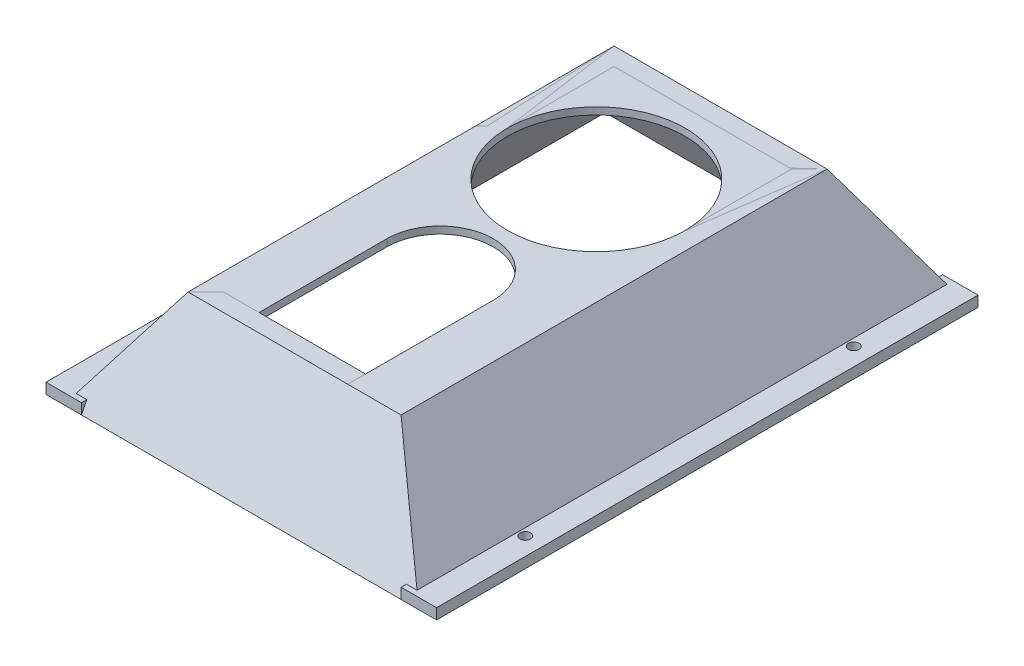
ISO-10303-21;
HEADER;
FILE_DESCRIPTION(('STEP AP214'),'2;1');
FILE_NAME('part.step','',(''),(''),'','','');
FILE_SCHEMA(('AUTOMOTIVE_DESIGN { 1 0 10303 214 1 1 1 1 }'));
ENDSEC;
DATA;
#1=APPLICATION_CONTEXT('core data for automotive mechanical design processes');
#2=APPLICATION_PROTOCOL_DEFINITION('international standard','automotive_design',2000,#1);
#3=PRODUCT_CONTEXT('',#1,'mechanical');
#4=PRODUCT('Part','Part','',(#3));
#5=PRODUCT_RELATED_PRODUCT_CATEGORY('part','',(#4));
#6=PRODUCT_DEFINITION_FORMATION('','',#4);
#7=PRODUCT_DEFINITION_CONTEXT('part definition',#1,'design');
#8=PRODUCT_DEFINITION('design','',#6,#7);
#9=PRODUCT_DEFINITION_SHAPE('','',#8);
#10=(LENGTH_UNIT() NAMED_UNIT(*) SI_UNIT(.MILLI.,.METRE.));
#11=(NAMED_UNIT(*) PLANE_ANGLE_UNIT() SI_UNIT($,.RADIAN.));
#12=(NAMED_UNIT(*) SI_UNIT($,.STERADIAN.) SOLID_ANGLE_UNIT());
#13=UNCERTAINTY_MEASURE_WITH_UNIT(LENGTH_MEASURE(1.E-05),#10,'distance_accuracy_value','');
#14=(GEOMETRIC_REPRESENTATION_CONTEXT(3) GLOBAL_UNCERTAINTY_ASSIGNED_CONTEXT((#13)) GLOBAL_UNIT_ASSIGNED_CONTEXT((#10,
#11,#12)) REPRESENTATION_CONTEXT('',''));
#15=CARTESIAN_POINT('',(0.,0.,0.));
#16=DIRECTION('',(0.,0.,1.));
#17=DIRECTION('',(1.,0.,0.));
#18=AXIS2_PLACEMENT_3D('',#15,#16,#17);
#19=CARTESIAN_POINT('',(0.,28.,-56.));
#20=DIRECTION('',(0.,1.,0.));
#21=DIRECTION('',(0.,0.,1.));
#22=AXIS2_PLACEMENT_3D('',#19,#20,#21);
#23=CYLINDRICAL_SURFACE('',#22,15.);
#24=CARTESIAN_POINT('',(0.,30.,-56.));
#25=DIRECTION('',(0.,1.,0.));
#26=DIRECTION('',(0.,0.,1.));
#27=AXIS2_PLACEMENT_3D('',#24,#25,#26);
#28=CIRCLE('',#27,15.);
#29=CARTESIAN_POINT('',(-15.,30.,-56.));
#30=VERTEX_POINT('',#29);
#31=CARTESIAN_POINT('',(15.,30.,-56.));
#32=VERTEX_POINT('',#31);
#33=EDGE_CURVE('E173',#30,#32,#28,.F.);
#34=ORIENTED_EDGE('',*,*,#33,.F.);
#35=DIRECTION('',(0.,1.,0.));
#36=VECTOR('',#35,1.);
#37=CARTESIAN_POINT('',(-15.,28.,-56.));
#38=LINE('',#37,#36);
#39=CARTESIAN_POINT('',(-15.,28.,-56.));
#40=VERTEX_POINT('',#39);
#41=EDGE_CURVE('E13',#40,#30,#38,.T.);
#42=ORIENTED_EDGE('',*,*,#41,.F.);
#43=CARTESIAN_POINT('',(0.,28.,-56.));
#44=DIRECTION('',(0.,1.,0.));
#45=DIRECTION('',(0.,0.,1.));
#46=AXIS2_PLACEMENT_3D('',#43,#44,#45);
#47=CIRCLE('',#46,15.);
#48=CARTESIAN_POINT('',(15.,28.,-56.));
#49=VERTEX_POINT('',#48);
#50=EDGE_CURVE('E202',#40,#49,#47,.F.);
#51=ORIENTED_EDGE('',*,*,#50,.T.);
#52=DIRECTION('',(0.,1.,0.));
#53=VECTOR('',#52,1.);
#54=CARTESIAN_POINT('',(15.,28.,-56.));
#55=LINE('',#54,#53);
#56=EDGE_CURVE('E75',#49,#32,#55,.T.);
#57=ORIENTED_EDGE('',*,*,#56,.T.);
#58=EDGE_LOOP('',(#34,#42,#51,#57));
#59=FACE_BOUND('',#58,.T.);
#60=ADVANCED_FACE('F71',(#59),#23,.F.);
#61=CARTESIAN_POINT('',(-15.,28.,0.));
#62=DIRECTION('',(-1.,0.,0.));
#63=DIRECTION('',(0.,0.,1.));
#64=AXIS2_PLACEMENT_3D('',#61,#62,#63);
#65=PLANE('',#64);
#66=DIRECTION('',(0.,0.,1.));
#67=VECTOR('',#66,1.);
#68=CARTESIAN_POINT('',(-15.,30.,0.));
#69=LINE('',#68,#67);
#70=CARTESIAN_POINT('',(-15.,30.,-15.));
#71=VERTEX_POINT('',#70);
#72=EDGE_CURVE('E191',#30,#71,#69,.T.);
#73=ORIENTED_EDGE('',*,*,#72,.T.);
#74=DIRECTION('',(0.,1.,0.));
#75=VECTOR('',#74,1.);
#76=CARTESIAN_POINT('',(-15.,28.,-15.));
#77=LINE('',#76,#75);
#78=CARTESIAN_POINT('',(-15.,28.,-15.));
#79=VERTEX_POINT('',#78);
#80=EDGE_CURVE('E81',#79,#71,#77,.T.);
#81=ORIENTED_EDGE('',*,*,#80,.F.);
#82=DIRECTION('',(0.,0.,1.));
#83=VECTOR('',#82,1.);
#84=CARTESIAN_POINT('',(-15.,28.,0.));
#85=LINE('',#84,#83);
#86=EDGE_CURVE('E159',#40,#79,#85,.T.);
#87=ORIENTED_EDGE('',*,*,#86,.F.);
#88=ORIENTED_EDGE('',*,*,#41,.T.);
#89=EDGE_LOOP('',(#73,#81,#87,#88));
#90=FACE_BOUND('',#89,.T.);
#91=ADVANCED_FACE('F206',(#90),#65,.F.);
#92=CARTESIAN_POINT('',(0.,28.,-15.));
#93=DIRECTION('',(0.,0.,1.));
#94=DIRECTION('',(1.,0.,0.));
#95=AXIS2_PLACEMENT_3D('',#92,#93,#94);
#96=PLANE('',#95);
#97=DIRECTION('',(1.,0.,0.));
#98=VECTOR('',#97,1.);
#99=CARTESIAN_POINT('',(0.,30.,-15.));
#100=LINE('',#99,#98);
#101=CARTESIAN_POINT('',(-30.,30.,-15.));
#102=VERTEX_POINT('',#101);
#103=EDGE_CURVE('E146',#102,#71,#100,.T.);
#104=ORIENTED_EDGE('',*,*,#103,.F.);
#105=DIRECTION('',(0.,1.,0.));
#106=VECTOR('',#105,1.);
#107=CARTESIAN_POINT('',(-30.,28.,-15.));
#108=LINE('',#107,#106);
#109=CARTESIAN_POINT('',(-30.,28.,-15.));
#110=VERTEX_POINT('',#109);
#111=EDGE_CURVE('E141',#110,#102,#108,.T.);
#112=ORIENTED_EDGE('',*,*,#111,.F.);
#113=DIRECTION('',(1.,0.,0.));
#114=VECTOR('',#113,1.);
#115=CARTESIAN_POINT('',(0.,28.,-15.));
#116=LINE('',#115,#114);
#117=EDGE_CURVE('E144',#110,#79,#116,.T.);
#118=ORIENTED_EDGE('',*,*,#117,.T.);
#119=ORIENTED_EDGE('',*,*,#80,.T.);
#120=EDGE_LOOP('',(#104,#112,#118,#119));
#121=FACE_BOUND('',#120,.T.);
#122=ADVANCED_FACE('F143',(#121),#96,.T.);
#123=CARTESIAN_POINT('',(-30.,28.,0.));
#124=DIRECTION('',(-1.,0.,0.));
#125=DIRECTION('',(0.,0.,1.));
#126=AXIS2_PLACEMENT_3D('',#123,#124,#125);
#127=PLANE('',#126);
#128=DIRECTION('',(0.,0.,1.));
#129=VECTOR('',#128,1.);
#130=CARTESIAN_POINT('',(-30.,30.,0.));
#131=LINE('',#130,#129);
#132=CARTESIAN_POINT('',(-30.,30.,-135.));
#133=VERTEX_POINT('',#132);
#134=EDGE_CURVE('E188',#133,#102,#131,.T.);
#135=ORIENTED_EDGE('',*,*,#134,.F.);
#136=DIRECTION('',(0.,1.,0.));
#137=VECTOR('',#136,1.);
#138=CARTESIAN_POINT('',(-30.,28.,-135.));
#139=LINE('',#138,#137);
#140=CARTESIAN_POINT('',(-30.,28.,-135.));
#141=VERTEX_POINT('',#140);
#142=EDGE_CURVE('E151',#141,#133,#139,.T.);
#143=ORIENTED_EDGE('',*,*,#142,.F.);
#144=DIRECTION('',(0.,0.,1.));
#145=VECTOR('',#144,1.);
#146=CARTESIAN_POINT('',(-30.,28.,0.));
#147=LINE('',#146,#145);
#148=EDGE_CURVE('E158',#141,#110,#147,.T.);
#149=ORIENTED_EDGE('',*,*,#148,.T.);
#150=ORIENTED_EDGE('',*,*,#111,.T.);
#151=EDGE_LOOP('',(#135,#143,#149,#150));
#152=FACE_BOUND('',#151,.T.);
#153=ADVANCED_FACE('F161',(#152),#127,.T.);
#154=CARTESIAN_POINT('',(0.,28.,-135.));
#155=DIRECTION('',(0.,0.,1.));
#156=DIRECTION('',(1.,0.,0.));
#157=AXIS2_PLACEMENT_3D('',#154,#155,#156);
#158=PLANE('',#157);
#159=DIRECTION('',(1.,0.,0.));
#160=VECTOR('',#159,1.);
#161=CARTESIAN_POINT('',(0.,30.,-135.));
#162=LINE('',#161,#160);
#163=CARTESIAN_POINT('',(30.,30.,-135.));
#164=VERTEX_POINT('',#163);
#165=EDGE_CURVE('E185',#133,#164,#162,.T.);
#166=ORIENTED_EDGE('',*,*,#165,.T.);
#167=DIRECTION('',(0.,1.,0.));
#168=VECTOR('',#167,1.);
#169=CARTESIAN_POINT('',(30.,28.,-135.));
#170=LINE('',#169,#168);
#171=CARTESIAN_POINT('',(30.,28.,-135.));
#172=VERTEX_POINT('',#171);
#173=EDGE_CURVE('E196',#172,#164,#170,.T.);
#174=ORIENTED_EDGE('',*,*,#173,.F.);
#175=DIRECTION('',(1.,0.,0.));
#176=VECTOR('',#175,1.);
#177=CARTESIAN_POINT('',(0.,28.,-135.));
#178=LINE('',#177,#176);
#179=EDGE_CURVE('E163',#141,#172,#178,.T.);
#180=ORIENTED_EDGE('',*,*,#179,.F.);
#181=ORIENTED_EDGE('',*,*,#142,.T.);
#182=EDGE_LOOP('',(#166,#174,#180,#181));
#183=FACE_BOUND('',#182,.T.);
#184=ADVANCED_FACE('F224',(#183),#158,.F.);
#185=CARTESIAN_POINT('',(30.,28.,0.));
#186=DIRECTION('',(-1.,0.,0.));
#187=DIRECTION('',(0.,0.,1.));
#188=AXIS2_PLACEMENT_3D('',#185,#186,#187);
#189=PLANE('',#188);
#190=DIRECTION('',(0.,0.,1.));
#191=VECTOR('',#190,1.);
#192=CARTESIAN_POINT('',(30.,30.,0.));
#193=LINE('',#192,#191);
#194=CARTESIAN_POINT('',(30.,30.,-15.));
#195=VERTEX_POINT('',#194);
#196=EDGE_CURVE('E182',#164,#195,#193,.T.);
#197=ORIENTED_EDGE('',*,*,#196,.T.);
#198=DIRECTION('',(0.,1.,0.));
#199=VECTOR('',#198,1.);
#200=CARTESIAN_POINT('',(30.,28.,-15.));
#201=LINE('',#200,#199);
#202=CARTESIAN_POINT('',(30.,28.,-15.));
#203=VERTEX_POINT('',#202);
#204=EDGE_CURVE('E199',#203,#195,#201,.T.);
#205=ORIENTED_EDGE('',*,*,#204,.F.);
#206=DIRECTION('',(0.,0.,1.));
#207=VECTOR('',#206,1.);
#208=CARTESIAN_POINT('',(30.,28.,0.));
#209=LINE('',#208,#207);
#210=EDGE_CURVE('E165',#172,#203,#209,.T.);
#211=ORIENTED_EDGE('',*,*,#210,.F.);
#212=ORIENTED_EDGE('',*,*,#173,.T.);
#213=EDGE_LOOP('',(#197,#205,#211,#212));
#214=FACE_BOUND('',#213,.T.);
#215=ADVANCED_FACE('F219',(#214),#189,.F.);
#216=CARTESIAN_POINT('',(0.,28.,-15.));
#217=DIRECTION('',(0.,0.,1.));
#218=DIRECTION('',(1.,0.,0.));
#219=AXIS2_PLACEMENT_3D('',#216,#217,#218);
#220=PLANE('',#219);
#221=DIRECTION('',(1.,0.,0.));
#222=VECTOR('',#221,1.);
#223=CARTESIAN_POINT('',(0.,30.,-15.));
#224=LINE('',#223,#222);
#225=CARTESIAN_POINT('',(15.,30.,-15.));
#226=VERTEX_POINT('',#225);
#227=EDGE_CURVE('E179',#226,#195,#224,.T.);
#228=ORIENTED_EDGE('',*,*,#227,.F.);
#229=DIRECTION('',(0.,1.,0.));
#230=VECTOR('',#229,1.);
#231=CARTESIAN_POINT('',(15.,28.,-15.));
#232=LINE('',#231,#230);
#233=CARTESIAN_POINT('',(15.,28.,-15.));
#234=VERTEX_POINT('',#233);
#235=EDGE_CURVE('E200',#234,#226,#232,.T.);
#236=ORIENTED_EDGE('',*,*,#235,.F.);
#237=DIRECTION('',(1.,0.,0.));
#238=VECTOR('',#237,1.);
#239=CARTESIAN_POINT('',(0.,28.,-15.));
#240=LINE('',#239,#238);
#241=EDGE_CURVE('E210',#234,#203,#240,.T.);
#242=ORIENTED_EDGE('',*,*,#241,.T.);
#243=ORIENTED_EDGE('',*,*,#204,.T.);
#244=EDGE_LOOP('',(#228,#236,#242,#243));
#245=FACE_BOUND('',#244,.T.);
#246=ADVANCED_FACE('F221',(#245),#220,.T.);
#247=CARTESIAN_POINT('',(0.,28.,-100.));
#248=DIRECTION('',(0.,1.,0.));
#249=DIRECTION('',(0.,0.,1.));
#250=AXIS2_PLACEMENT_3D('',#247,#248,#249);
#251=CYLINDRICAL_SURFACE('',#250,25.);
#252=CARTESIAN_POINT('',(0.,28.,-100.));
#253=DIRECTION('',(0.,1.,0.));
#254=DIRECTION('',(0.,0.,1.));
#255=AXIS2_PLACEMENT_3D('',#252,#253,#254);
#256=CIRCLE('',#255,25.);
#257=CARTESIAN_POINT('',(0.,28.,-75.));
#258=VERTEX_POINT('',#257);
#259=EDGE_CURVE('E192',#258,#258,#256,.T.);
#260=ORIENTED_EDGE('',*,*,#259,.F.);
#261=EDGE_LOOP('',(#260));
#262=FACE_BOUND('',#261,.T.);
#263=CARTESIAN_POINT('',(0.,30.,-100.));
#264=DIRECTION('',(0.,1.,0.));
#265=DIRECTION('',(0.,0.,1.));
#266=AXIS2_PLACEMENT_3D('',#263,#264,#265);
#267=CIRCLE('',#266,25.);
#268=CARTESIAN_POINT('',(0.,30.,-75.));
#269=VERTEX_POINT('',#268);
#270=EDGE_CURVE('E170',#269,#269,#267,.T.);
#271=ORIENTED_EDGE('',*,*,#270,.T.);
#272=EDGE_LOOP('',(#271));
#273=FACE_BOUND('',#272,.T.);
#274=ADVANCED_FACE('F73',(#262,#273),#251,.F.);
#275=CARTESIAN_POINT('',(15.,28.,0.));
#276=DIRECTION('',(-1.,0.,0.));
#277=DIRECTION('',(0.,0.,1.));
#278=AXIS2_PLACEMENT_3D('',#275,#276,#277);
#279=PLANE('',#278);
#280=DIRECTION('',(0.,0.,1.));
#281=VECTOR('',#280,1.);
#282=CARTESIAN_POINT('',(15.,30.,0.));
#283=LINE('',#282,#281);
#284=EDGE_CURVE('E176',#32,#226,#283,.T.);
#285=ORIENTED_EDGE('',*,*,#284,.F.);
#286=ORIENTED_EDGE('',*,*,#56,.F.);
#287=DIRECTION('',(0.,0.,1.));
#288=VECTOR('',#287,1.);
#289=CARTESIAN_POINT('',(15.,28.,0.));
#290=LINE('',#289,#288);
#291=EDGE_CURVE('E208',#49,#234,#290,.T.);
#292=ORIENTED_EDGE('',*,*,#291,.T.);
#293=ORIENTED_EDGE('',*,*,#235,.T.);
#294=EDGE_LOOP('',(#285,#286,#292,#293));
#295=FACE_BOUND('',#294,.T.);
#296=ADVANCED_FACE('F203',(#295),#279,.T.);
#297=CARTESIAN_POINT('',(0.,28.,0.));
#298=DIRECTION('',(0.,1.,0.));
#299=DIRECTION('',(0.,0.,1.));
#300=AXIS2_PLACEMENT_3D('',#297,#298,#299);
#301=PLANE('',#300);
#302=ORIENTED_EDGE('',*,*,#259,.T.);
#303=EDGE_LOOP('',(#302));
#304=FACE_BOUND('',#303,.T.);
#305=ORIENTED_EDGE('',*,*,#50,.F.);
#306=ORIENTED_EDGE('',*,*,#86,.T.);
#307=ORIENTED_EDGE('',*,*,#117,.F.);
#308=ORIENTED_EDGE('',*,*,#148,.F.);
#309=ORIENTED_EDGE('',*,*,#179,.T.);
#310=ORIENTED_EDGE('',*,*,#210,.T.);
#311=ORIENTED_EDGE('',*,*,#241,.F.);
#312=ORIENTED_EDGE('',*,*,#291,.F.);
#313=EDGE_LOOP('',(#305,#306,#307,#308,#309,#310,#311,#312));
#314=FACE_BOUND('',#313,.T.);
#315=ADVANCED_FACE('F156',(#304,#314),#301,.F.);
#316=CARTESIAN_POINT('',(0.,30.,0.));
#317=DIRECTION('',(0.,1.,0.));
#318=DIRECTION('',(0.,0.,1.));
#319=AXIS2_PLACEMENT_3D('',#316,#317,#318);
#320=PLANE('',#319);
#321=ORIENTED_EDGE('',*,*,#270,.F.);
#322=EDGE_LOOP('',(#321));
#323=FACE_BOUND('',#322,.T.);
#324=ORIENTED_EDGE('',*,*,#33,.T.);
#325=ORIENTED_EDGE('',*,*,#284,.T.);
#326=ORIENTED_EDGE('',*,*,#227,.T.);
#327=ORIENTED_EDGE('',*,*,#196,.F.);
#328=ORIENTED_EDGE('',*,*,#165,.F.);
#329=ORIENTED_EDGE('',*,*,#134,.T.);
#330=ORIENTED_EDGE('',*,*,#103,.T.);
#331=ORIENTED_EDGE('',*,*,#72,.F.);
#332=EDGE_LOOP('',(#324,#325,#326,#327,#328,#329,#330,#331));
#333=FACE_BOUND('',#332,.T.);
#334=ADVANCED_FACE('F205',(#323,#333),#320,.T.);
#335=CLOSED_SHELL('',(#60,#91,#122,#153,#184,#215,#246,#274,#296,#315,#334));
#336=MANIFOLD_SOLID_BREP('B2',#335);
#337=CARTESIAN_POINT('',(0.,66.3730569948186,-113.782383419689));
#338=DIRECTION('',(0.,-0.503871025524086,0.863778900898434));
#339=DIRECTION('',(0.,-0.863778900898434,-0.503871025524086));
#340=AXIS2_PLACEMENT_3D('',#337,#338,#339);
#341=PLANE('',#340);
#342=DIRECTION('',(-1.,0.,0.));
#343=VECTOR('',#342,1.);
#344=CARTESIAN_POINT('',(0.,3.,-150.75));
#345=LINE('',#344,#343);
#346=CARTESIAN_POINT('',(48.,3.,-150.75));
#347=VERTEX_POINT('',#346);
#348=CARTESIAN_POINT('',(45.,3.,-150.75));
#349=VERTEX_POINT('',#348);
#350=EDGE_CURVE('E379',#347,#349,#345,.T.);
#351=ORIENTED_EDGE('',*,*,#350,.T.);
#352=DIRECTION('',(0.,-0.863778900898434,-0.503871025524086));
#353=VECTOR('',#352,1.);
#354=CARTESIAN_POINT('',(45.,66.3730569948186,-113.782383419689));
#355=LINE('',#354,#353);
#356=CARTESIAN_POINT('',(45.,0.,-152.5));
#357=VERTEX_POINT('',#356);
#358=EDGE_CURVE('E540',#349,#357,#355,.T.);
#359=ORIENTED_EDGE('',*,*,#358,.T.);
#360=DIRECTION('',(-1.,0.,0.));
#361=VECTOR('',#360,1.);
#362=CARTESIAN_POINT('',(-50.,0.,-152.5));
#363=LINE('',#362,#361);
#364=CARTESIAN_POINT('',(-45.,0.,-152.5));
#365=VERTEX_POINT('',#364);
#366=EDGE_CURVE('E563',#357,#365,#363,.T.);
#367=ORIENTED_EDGE('',*,*,#366,.T.);
#368=DIRECTION('',(0.,-0.863778900898434,-0.503871025524086));
#369=VECTOR('',#368,1.);
#370=CARTESIAN_POINT('',(-45.,66.3730569948186,-113.782383419689));
#371=LINE('',#370,#369);
#372=CARTESIAN_POINT('',(-45.,3.,-150.75));
#373=VERTEX_POINT('',#372);
#374=EDGE_CURVE('E945',#373,#365,#371,.T.);
#375=ORIENTED_EDGE('',*,*,#374,.F.);
#376=DIRECTION('',(-1.,0.,0.));
#377=VECTOR('',#376,1.);
#378=CARTESIAN_POINT('',(0.,3.,-150.75));
#379=LINE('',#378,#377);
#380=CARTESIAN_POINT('',(-48.,3.00000000000001,-150.75));
#381=VERTEX_POINT('',#380);
#382=EDGE_CURVE('E708',#373,#381,#379,.T.);
#383=ORIENTED_EDGE('',*,*,#382,.T.);
#384=DIRECTION('',(0.499026289241445,0.748539433862166,0.436648003086263));
#385=VECTOR('',#384,1.);
#386=CARTESIAN_POINT('',(-50.,0.,-152.5));
#387=LINE('',#386,#385);
#388=CARTESIAN_POINT('',(-30.,30.,-135.));
#389=VERTEX_POINT('',#388);
#390=EDGE_CURVE('E562',#381,#389,#387,.T.);
#391=ORIENTED_EDGE('',*,*,#390,.T.);
#392=DIRECTION('',(-1.,0.,0.));
#393=VECTOR('',#392,1.);
#394=CARTESIAN_POINT('',(-30.,30.,-135.));
#395=LINE('',#394,#393);
#396=CARTESIAN_POINT('',(30.,30.,-135.));
#397=VERTEX_POINT('',#396);
#398=EDGE_CURVE('E771',#397,#389,#395,.T.);
#399=ORIENTED_EDGE('',*,*,#398,.F.);
#400=DIRECTION('',(-0.499026289241443,0.748539433862167,0.436648003086264));
#401=VECTOR('',#400,1.);
#402=CARTESIAN_POINT('',(50.,0.,-152.5));
#403=LINE('',#402,#401);
#404=EDGE_CURVE('E725',#347,#397,#403,.T.);
#405=ORIENTED_EDGE('',*,*,#404,.F.);
#406=EDGE_LOOP('',(#351,#359,#367,#375,#383,#391,#399,#405));
#407=FACE_BOUND('',#406,.T.);
#408=ADVANCED_FACE('F360',(#407),#341,.F.);
#409=CARTESIAN_POINT('',(0.,0.,0.));
#410=DIRECTION('',(0.,-0.447213595499958,-0.894427190999916));
#411=DIRECTION('',(0.,0.894427190999916,-0.447213595499958));
#412=AXIS2_PLACEMENT_3D('',#409,#410,#411);
#413=PLANE('',#412);
#414=DIRECTION('',(1.,0.,0.));
#415=VECTOR('',#414,1.);
#416=CARTESIAN_POINT('',(-50.,0.,0.));
#417=LINE('',#416,#415);
#418=CARTESIAN_POINT('',(-45.,0.,0.));
#419=VERTEX_POINT('',#418);
#420=CARTESIAN_POINT('',(45.,0.,0.));
#421=VERTEX_POINT('',#420);
#422=EDGE_CURVE('E919',#419,#421,#417,.T.);
#423=ORIENTED_EDGE('',*,*,#422,.T.);
#424=DIRECTION('',(0.,0.894427190999916,-0.447213595499958));
#425=VECTOR('',#424,1.);
#426=CARTESIAN_POINT('',(45.,0.,0.));
#427=LINE('',#426,#425);
#428=CARTESIAN_POINT('',(45.,3.,-1.50000000000004));
#429=VERTEX_POINT('',#428);
#430=EDGE_CURVE('E387',#421,#429,#427,.T.);
#431=ORIENTED_EDGE('',*,*,#430,.T.);
#432=DIRECTION('',(1.,0.,0.));
#433=VECTOR('',#432,1.);
#434=CARTESIAN_POINT('',(0.,3.,-1.50000000000002));
#435=LINE('',#434,#433);
#436=CARTESIAN_POINT('',(48.,3.00000000000001,-1.50000000000003));
#437=VERTEX_POINT('',#436);
#438=EDGE_CURVE('E507',#429,#437,#435,.T.);
#439=ORIENTED_EDGE('',*,*,#438,.T.);
#440=DIRECTION('',(-0.512147519731584,0.768221279597376,-0.384110639798687));
#441=VECTOR('',#440,1.);
#442=CARTESIAN_POINT('',(50.,0.,0.));
#443=LINE('',#442,#441);
#444=CARTESIAN_POINT('',(30.,30.,-15.));
#445=VERTEX_POINT('',#444);
#446=EDGE_CURVE('E724',#437,#445,#443,.T.);
#447=ORIENTED_EDGE('',*,*,#446,.T.);
#448=DIRECTION('',(1.,0.,0.));
#449=VECTOR('',#448,1.);
#450=CARTESIAN_POINT('',(-30.,30.,-15.));
#451=LINE('',#450,#449);
#452=CARTESIAN_POINT('',(-30.,30.,-15.));
#453=VERTEX_POINT('',#452);
#454=EDGE_CURVE('E772',#453,#445,#451,.T.);
#455=ORIENTED_EDGE('',*,*,#454,.F.);
#456=DIRECTION('',(0.512147519731584,0.768221279597376,-0.384110639798688));
#457=VECTOR('',#456,1.);
#458=CARTESIAN_POINT('',(-50.,0.,0.));
#459=LINE('',#458,#457);
#460=CARTESIAN_POINT('',(-48.,3.,-1.5));
#461=VERTEX_POINT('',#460);
#462=EDGE_CURVE('E720',#461,#453,#459,.T.);
#463=ORIENTED_EDGE('',*,*,#462,.F.);
#464=DIRECTION('',(1.,0.,0.));
#465=VECTOR('',#464,1.);
#466=CARTESIAN_POINT('',(0.,3.,-1.50000000000002));
#467=LINE('',#466,#465);
#468=CARTESIAN_POINT('',(-45.,3.,-1.5));
#469=VERTEX_POINT('',#468);
#470=EDGE_CURVE('E371',#461,#469,#467,.T.);
#471=ORIENTED_EDGE('',*,*,#470,.T.);
#472=DIRECTION('',(0.,0.894427190999916,-0.447213595499958));
#473=VECTOR('',#472,1.);
#474=CARTESIAN_POINT('',(-45.,0.,0.));
#475=LINE('',#474,#473);
#476=EDGE_CURVE('E941',#419,#469,#475,.T.);
#477=ORIENTED_EDGE('',*,*,#476,.F.);
#478=EDGE_LOOP('',(#423,#431,#439,#447,#455,#463,#471,#477));
#479=FACE_BOUND('',#478,.T.);
#480=ADVANCED_FACE('F737',(#479),#413,.F.);
#481=CARTESIAN_POINT('',(0.,30.,0.));
#482=DIRECTION('',(0.,1.,0.));
#483=DIRECTION('',(0.,0.,1.));
#484=AXIS2_PLACEMENT_3D('',#481,#482,#483);
#485=PLANE('',#484);
#486=DIRECTION('',(0.,0.,-1.));
#487=VECTOR('',#486,1.);
#488=CARTESIAN_POINT('',(25.,30.,-130.));
#489=LINE('',#488,#487);
#490=CARTESIAN_POINT('',(25.,30.,-20.));
#491=VERTEX_POINT('',#490);
#492=CARTESIAN_POINT('',(25.,30.,-130.));
#493=VERTEX_POINT('',#492);
#494=EDGE_CURVE('E674',#491,#493,#489,.T.);
#495=ORIENTED_EDGE('',*,*,#494,.F.);
#496=DIRECTION('',(1.,0.,0.));
#497=VECTOR('',#496,1.);
#498=CARTESIAN_POINT('',(-25.,30.,-20.));
#499=LINE('',#498,#497);
#500=CARTESIAN_POINT('',(-25.,30.,-20.));
#501=VERTEX_POINT('',#500);
#502=EDGE_CURVE('E652',#501,#491,#499,.T.);
#503=ORIENTED_EDGE('',*,*,#502,.F.);
#504=DIRECTION('',(0.,0.,1.));
#505=VECTOR('',#504,1.);
#506=CARTESIAN_POINT('',(-25.,30.,-130.));
#507=LINE('',#506,#505);
#508=CARTESIAN_POINT('',(-25.,30.,-130.));
#509=VERTEX_POINT('',#508);
#510=EDGE_CURVE('E640',#509,#501,#507,.T.);
#511=ORIENTED_EDGE('',*,*,#510,.F.);
#512=DIRECTION('',(-1.,0.,0.));
#513=VECTOR('',#512,1.);
#514=CARTESIAN_POINT('',(-25.,30.,-130.));
#515=LINE('',#514,#513);
#516=EDGE_CURVE('E663',#493,#509,#515,.T.);
#517=ORIENTED_EDGE('',*,*,#516,.F.);
#518=EDGE_LOOP('',(#495,#503,#511,#517));
#519=FACE_BOUND('',#518,.T.);
#520=DIRECTION('',(0.,0.,1.));
#521=VECTOR('',#520,1.);
#522=CARTESIAN_POINT('',(-30.,30.,-135.));
#523=LINE('',#522,#521);
#524=EDGE_CURVE('E777',#389,#453,#523,.T.);
#525=ORIENTED_EDGE('',*,*,#524,.T.);
#526=ORIENTED_EDGE('',*,*,#454,.T.);
#527=DIRECTION('',(0.,0.,-1.));
#528=VECTOR('',#527,1.);
#529=CARTESIAN_POINT('',(30.,30.,-135.));
#530=LINE('',#529,#528);
#531=EDGE_CURVE('E764',#445,#397,#530,.T.);
#532=ORIENTED_EDGE('',*,*,#531,.T.);
#533=ORIENTED_EDGE('',*,*,#398,.T.);
#534=EDGE_LOOP('',(#525,#526,#532,#533));
#535=FACE_BOUND('',#534,.T.);
#536=ADVANCED_FACE('F362',(#519,#535),#485,.T.);
#537=CARTESIAN_POINT('',(0.,0.,0.));
#538=DIRECTION('',(0.,1.,0.));
#539=DIRECTION('',(0.,0.,1.));
#540=AXIS2_PLACEMENT_3D('',#537,#538,#539);
#541=PLANE('',#540);
#542=CARTESIAN_POINT('',(50.,0.,-30.));
#543=DIRECTION('',(0.,1.,0.));
#544=DIRECTION('',(0.,0.,1.));
#545=AXIS2_PLACEMENT_3D('',#542,#543,#544);
#546=CIRCLE('',#545,1.49999999999999);
#547=CARTESIAN_POINT('',(50.,0.,-28.5));
#548=VERTEX_POINT('',#547);
#549=EDGE_CURVE('E365',#548,#548,#546,.T.);
#550=ORIENTED_EDGE('',*,*,#549,.T.);
#551=EDGE_LOOP('',(#550));
#552=FACE_BOUND('',#551,.T.);
#553=CARTESIAN_POINT('',(-50.,0.,-30.));
#554=DIRECTION('',(0.,1.,0.));
#555=DIRECTION('',(0.,0.,1.));
#556=AXIS2_PLACEMENT_3D('',#553,#554,#555);
#557=CIRCLE('',#556,1.49999999999999);
#558=CARTESIAN_POINT('',(-50.,0.,-28.5));
#559=VERTEX_POINT('',#558);
#560=EDGE_CURVE('E1299',#559,#559,#557,.T.);
#561=ORIENTED_EDGE('',*,*,#560,.T.);
#562=EDGE_LOOP('',(#561));
#563=FACE_BOUND('',#562,.T.);
#564=CARTESIAN_POINT('',(-50.,0.,-122.5));
#565=DIRECTION('',(0.,1.,0.));
#566=DIRECTION('',(0.,0.,1.));
#567=AXIS2_PLACEMENT_3D('',#564,#565,#566);
#568=CIRCLE('',#567,1.49999999999999);
#569=CARTESIAN_POINT('',(-50.,0.,-121.));
#570=VERTEX_POINT('',#569);
#571=EDGE_CURVE('E1310',#570,#570,#568,.T.);
#572=ORIENTED_EDGE('',*,*,#571,.T.);
#573=EDGE_LOOP('',(#572));
#574=FACE_BOUND('',#573,.T.);
#575=CARTESIAN_POINT('',(50.,0.,-122.5));
#576=DIRECTION('',(0.,1.,0.));
#577=DIRECTION('',(0.,0.,1.));
#578=AXIS2_PLACEMENT_3D('',#575,#576,#577);
#579=CIRCLE('',#578,1.49999999999999);
#580=CARTESIAN_POINT('',(50.,0.,-121.));
#581=VERTEX_POINT('',#580);
#582=EDGE_CURVE('E533',#581,#581,#579,.T.);
#583=ORIENTED_EDGE('',*,*,#582,.T.);
#584=EDGE_LOOP('',(#583));
#585=FACE_BOUND('',#584,.T.);
#586=DIRECTION('',(0.,0.,-1.));
#587=VECTOR('',#586,1.);
#588=CARTESIAN_POINT('',(45.,0.,-147.5));
#589=LINE('',#588,#587);
#590=CARTESIAN_POINT('',(45.,0.,-5.));
#591=VERTEX_POINT('',#590);
#592=CARTESIAN_POINT('',(45.,0.,-147.5));
#593=VERTEX_POINT('',#592);
#594=EDGE_CURVE('E625',#591,#593,#589,.T.);
#595=ORIENTED_EDGE('',*,*,#594,.T.);
#596=DIRECTION('',(-1.,0.,0.));
#597=VECTOR('',#596,1.);
#598=CARTESIAN_POINT('',(-45.,0.,-147.5));
#599=LINE('',#598,#597);
#600=CARTESIAN_POINT('',(-45.,0.,-147.5));
#601=VERTEX_POINT('',#600);
#602=EDGE_CURVE('E690',#593,#601,#599,.T.);
#603=ORIENTED_EDGE('',*,*,#602,.T.);
#604=DIRECTION('',(0.,0.,1.));
#605=VECTOR('',#604,1.);
#606=CARTESIAN_POINT('',(-45.,0.,-147.5));
#607=LINE('',#606,#605);
#608=CARTESIAN_POINT('',(-45.,0.,-5.));
#609=VERTEX_POINT('',#608);
#610=EDGE_CURVE('E678',#601,#609,#607,.T.);
#611=ORIENTED_EDGE('',*,*,#610,.T.);
#612=DIRECTION('',(1.,0.,0.));
#613=VECTOR('',#612,1.);
#614=CARTESIAN_POINT('',(-45.,0.,-5.));
#615=LINE('',#614,#613);
#616=EDGE_CURVE('E688',#609,#591,#615,.T.);
#617=ORIENTED_EDGE('',*,*,#616,.T.);
#618=EDGE_LOOP('',(#595,#603,#611,#617));
#619=FACE_BOUND('',#618,.T.);
#620=ORIENTED_EDGE('',*,*,#366,.F.);
#621=CARTESIAN_POINT('',(55.,0.,-152.5));
#622=VERTEX_POINT('',#621);
#623=EDGE_CURVE('E557',#622,#357,#363,.T.);
#624=ORIENTED_EDGE('',*,*,#623,.F.);
#625=DIRECTION('',(0.,0.,1.));
#626=VECTOR('',#625,1.);
#627=CARTESIAN_POINT('',(55.,0.,0.));
#628=LINE('',#627,#626);
#629=CARTESIAN_POINT('',(55.,0.,0.));
#630=VERTEX_POINT('',#629);
#631=EDGE_CURVE('E526',#622,#630,#628,.T.);
#632=ORIENTED_EDGE('',*,*,#631,.T.);
#633=DIRECTION('',(-1.,0.,0.));
#634=VECTOR('',#633,1.);
#635=CARTESIAN_POINT('',(0.,0.,0.));
#636=LINE('',#635,#634);
#637=EDGE_CURVE('E529',#630,#421,#636,.T.);
#638=ORIENTED_EDGE('',*,*,#637,.T.);
#639=ORIENTED_EDGE('',*,*,#422,.F.);
#640=CARTESIAN_POINT('',(-55.,0.,0.));
#641=VERTEX_POINT('',#640);
#642=EDGE_CURVE('E921',#641,#419,#417,.T.);
#643=ORIENTED_EDGE('',*,*,#642,.F.);
#644=DIRECTION('',(0.,0.,1.));
#645=VECTOR('',#644,1.);
#646=CARTESIAN_POINT('',(-55.,0.,0.));
#647=LINE('',#646,#645);
#648=CARTESIAN_POINT('',(-55.,0.,-152.5));
#649=VERTEX_POINT('',#648);
#650=EDGE_CURVE('E969',#649,#641,#647,.T.);
#651=ORIENTED_EDGE('',*,*,#650,.F.);
#652=DIRECTION('',(-1.,0.,0.));
#653=VECTOR('',#652,1.);
#654=CARTESIAN_POINT('',(0.,0.,-152.5));
#655=LINE('',#654,#653);
#656=EDGE_CURVE('E966',#365,#649,#655,.T.);
#657=ORIENTED_EDGE('',*,*,#656,.F.);
#658=EDGE_LOOP('',(#620,#624,#632,#638,#639,#643,#651,#657));
#659=FACE_BOUND('',#658,.T.);
#660=ADVANCED_FACE('F578',(#552,#563,#574,#585,#619,#659),#541,.F.);
#661=CARTESIAN_POINT('',(34.6153846153846,23.076923076923,0.));
#662=DIRECTION('',(-0.832050294337844,-0.554700196225228,0.));
#663=DIRECTION('',(0.554700196225228,-0.832050294337844,0.));
#664=AXIS2_PLACEMENT_3D('',#661,#662,#663);
#665=PLANE('',#664);
#666=ORIENTED_EDGE('',*,*,#446,.F.);
#667=DIRECTION('',(0.,0.,-1.));
#668=VECTOR('',#667,1.);
#669=CARTESIAN_POINT('',(48.,3.,0.));
#670=LINE('',#669,#668);
#671=EDGE_CURVE('E69',#437,#347,#670,.T.);
#672=ORIENTED_EDGE('',*,*,#671,.T.);
#673=ORIENTED_EDGE('',*,*,#404,.T.);
#674=ORIENTED_EDGE('',*,*,#531,.F.);
#675=EDGE_LOOP('',(#666,#672,#673,#674));
#676=FACE_BOUND('',#675,.T.);
#677=ADVANCED_FACE('F588',(#676),#665,.F.);
#678=CARTESIAN_POINT('',(-34.6153846153846,23.0769230769231,0.));
#679=DIRECTION('',(0.832050294337844,-0.554700196225229,0.));
#680=DIRECTION('',(0.554700196225229,0.832050294337844,0.));
#681=AXIS2_PLACEMENT_3D('',#678,#679,#680);
#682=PLANE('',#681);
#683=ORIENTED_EDGE('',*,*,#390,.F.);
#684=DIRECTION('',(0.,0.,1.));
#685=VECTOR('',#684,1.);
#686=CARTESIAN_POINT('',(-48.,3.,0.));
#687=LINE('',#686,#685);
#688=EDGE_CURVE('E954',#381,#461,#687,.T.);
#689=ORIENTED_EDGE('',*,*,#688,.T.);
#690=ORIENTED_EDGE('',*,*,#462,.T.);
#691=ORIENTED_EDGE('',*,*,#524,.F.);
#692=EDGE_LOOP('',(#683,#689,#690,#691));
#693=FACE_BOUND('',#692,.T.);
#694=ADVANCED_FACE('F746',(#693),#682,.F.);
#695=CARTESIAN_POINT('',(31.1538461538462,20.7692307692308,0.));
#696=DIRECTION('',(0.832050294337844,0.554700196225229,0.));
#697=DIRECTION('',(-0.554700196225229,0.832050294337844,0.));
#698=AXIS2_PLACEMENT_3D('',#695,#696,#697);
#699=PLANE('',#698);
#700=DIRECTION('',(0.512147519731584,-0.768221279597376,0.384110639798688));
#701=VECTOR('',#700,1.);
#702=CARTESIAN_POINT('',(25.,30.,-20.));
#703=LINE('',#702,#701);
#704=EDGE_CURVE('E890',#491,#591,#703,.T.);
#705=ORIENTED_EDGE('',*,*,#704,.F.);
#706=ORIENTED_EDGE('',*,*,#494,.T.);
#707=DIRECTION('',(0.499026289241444,-0.748539433862167,-0.436648003086264));
#708=VECTOR('',#707,1.);
#709=CARTESIAN_POINT('',(25.,30.,-130.));
#710=LINE('',#709,#708);
#711=EDGE_CURVE('E845',#493,#593,#710,.T.);
#712=ORIENTED_EDGE('',*,*,#711,.T.);
#713=ORIENTED_EDGE('',*,*,#594,.F.);
#714=EDGE_LOOP('',(#705,#706,#712,#713));
#715=FACE_BOUND('',#714,.T.);
#716=ADVANCED_FACE('F872',(#715),#699,.F.);
#717=CARTESIAN_POINT('',(0.,64.1968911917098,-110.051813471503));
#718=DIRECTION('',(0.,0.503871025524086,-0.863778900898433));
#719=DIRECTION('',(0.,0.863778900898434,0.503871025524086));
#720=AXIS2_PLACEMENT_3D('',#717,#718,#719);
#721=PLANE('',#720);
#722=ORIENTED_EDGE('',*,*,#711,.F.);
#723=ORIENTED_EDGE('',*,*,#516,.T.);
#724=DIRECTION('',(-0.499026289241444,-0.748539433862167,-0.436648003086264));
#725=VECTOR('',#724,1.);
#726=CARTESIAN_POINT('',(-25.,30.,-130.));
#727=LINE('',#726,#725);
#728=EDGE_CURVE('E689',#509,#601,#727,.T.);
#729=ORIENTED_EDGE('',*,*,#728,.T.);
#730=ORIENTED_EDGE('',*,*,#602,.F.);
#731=EDGE_LOOP('',(#722,#723,#729,#730));
#732=FACE_BOUND('',#731,.T.);
#733=ADVANCED_FACE('F827',(#732),#721,.F.);
#734=CARTESIAN_POINT('',(0.,-2.,-4.));
#735=DIRECTION('',(0.,0.447213595499958,0.894427190999916));
#736=DIRECTION('',(0.,-0.894427190999916,0.447213595499958));
#737=AXIS2_PLACEMENT_3D('',#734,#735,#736);
#738=PLANE('',#737);
#739=DIRECTION('',(-0.512147519731584,-0.768221279597376,0.384110639798688));
#740=VECTOR('',#739,1.);
#741=CARTESIAN_POINT('',(-25.,30.,-20.));
#742=LINE('',#741,#740);
#743=EDGE_CURVE('E805',#501,#609,#742,.T.);
#744=ORIENTED_EDGE('',*,*,#743,.F.);
#745=ORIENTED_EDGE('',*,*,#502,.T.);
#746=ORIENTED_EDGE('',*,*,#704,.T.);
#747=ORIENTED_EDGE('',*,*,#616,.F.);
#748=EDGE_LOOP('',(#744,#745,#746,#747));
#749=FACE_BOUND('',#748,.T.);
#750=ADVANCED_FACE('F818',(#749),#738,.F.);
#751=CARTESIAN_POINT('',(-31.1538461538462,20.7692307692307,0.));
#752=DIRECTION('',(-0.832050294337844,0.554700196225228,0.));
#753=DIRECTION('',(-0.554700196225228,-0.832050294337844,0.));
#754=AXIS2_PLACEMENT_3D('',#751,#752,#753);
#755=PLANE('',#754);
#756=ORIENTED_EDGE('',*,*,#728,.F.);
#757=ORIENTED_EDGE('',*,*,#510,.T.);
#758=ORIENTED_EDGE('',*,*,#743,.T.);
#759=ORIENTED_EDGE('',*,*,#610,.F.);
#760=EDGE_LOOP('',(#756,#757,#758,#759));
#761=FACE_BOUND('',#760,.T.);
#762=ADVANCED_FACE('F590',(#761),#755,.F.);
#763=CARTESIAN_POINT('',(0.,3.,0.));
#764=DIRECTION('',(0.,1.,0.));
#765=DIRECTION('',(0.,0.,1.));
#766=AXIS2_PLACEMENT_3D('',#763,#764,#765);
#767=PLANE('',#766);
#768=CARTESIAN_POINT('',(-50.,3.,-30.));
#769=DIRECTION('',(0.,1.,0.));
#770=DIRECTION('',(0.,0.,1.));
#771=AXIS2_PLACEMENT_3D('',#768,#769,#770);
#772=CIRCLE('',#771,1.49999999999999);
#773=CARTESIAN_POINT('',(-50.,3.,-28.5));
#774=VERTEX_POINT('',#773);
#775=EDGE_CURVE('E1295',#774,#774,#772,.T.);
#776=ORIENTED_EDGE('',*,*,#775,.F.);
#777=EDGE_LOOP('',(#776));
#778=FACE_BOUND('',#777,.T.);
#779=CARTESIAN_POINT('',(-50.,3.,-122.5));
#780=DIRECTION('',(0.,1.,0.));
#781=DIRECTION('',(0.,0.,1.));
#782=AXIS2_PLACEMENT_3D('',#779,#780,#781);
#783=CIRCLE('',#782,1.49999999999999);
#784=CARTESIAN_POINT('',(-50.,3.,-121.));
#785=VERTEX_POINT('',#784);
#786=EDGE_CURVE('E1306',#785,#785,#783,.T.);
#787=ORIENTED_EDGE('',*,*,#786,.F.);
#788=EDGE_LOOP('',(#787));
#789=FACE_BOUND('',#788,.T.);
#790=ORIENTED_EDGE('',*,*,#382,.F.);
#791=DIRECTION('',(0.,0.,-1.));
#792=VECTOR('',#791,1.);
#793=CARTESIAN_POINT('',(-45.,3.,0.));
#794=LINE('',#793,#792);
#795=CARTESIAN_POINT('',(-45.,3.,-152.5));
#796=VERTEX_POINT('',#795);
#797=EDGE_CURVE('E997',#373,#796,#794,.T.);
#798=ORIENTED_EDGE('',*,*,#797,.T.);
#799=DIRECTION('',(-1.,0.,0.));
#800=VECTOR('',#799,1.);
#801=CARTESIAN_POINT('',(0.,3.,-152.5));
#802=LINE('',#801,#800);
#803=CARTESIAN_POINT('',(-55.,3.,-152.5));
#804=VERTEX_POINT('',#803);
#805=EDGE_CURVE('E987',#796,#804,#802,.T.);
#806=ORIENTED_EDGE('',*,*,#805,.T.);
#807=DIRECTION('',(0.,0.,1.));
#808=VECTOR('',#807,1.);
#809=CARTESIAN_POINT('',(-55.,3.,0.));
#810=LINE('',#809,#808);
#811=CARTESIAN_POINT('',(-55.,3.,0.));
#812=VERTEX_POINT('',#811);
#813=EDGE_CURVE('E973',#804,#812,#810,.T.);
#814=ORIENTED_EDGE('',*,*,#813,.T.);
#815=DIRECTION('',(1.,0.,0.));
#816=VECTOR('',#815,1.);
#817=CARTESIAN_POINT('',(0.,3.,0.));
#818=LINE('',#817,#816);
#819=CARTESIAN_POINT('',(-45.,3.,0.));
#820=VERTEX_POINT('',#819);
#821=EDGE_CURVE('E977',#812,#820,#818,.T.);
#822=ORIENTED_EDGE('',*,*,#821,.T.);
#823=EDGE_CURVE('E992',#820,#469,#794,.T.);
#824=ORIENTED_EDGE('',*,*,#823,.T.);
#825=ORIENTED_EDGE('',*,*,#470,.F.);
#826=ORIENTED_EDGE('',*,*,#688,.F.);
#827=EDGE_LOOP('',(#790,#798,#806,#814,#822,#824,#825,#826));
#828=FACE_BOUND('',#827,.T.);
#829=ADVANCED_FACE('F1078',(#778,#789,#828),#767,.T.);
#830=CARTESIAN_POINT('',(-45.,3.,0.));
#831=DIRECTION('',(-1.,0.,0.));
#832=DIRECTION('',(0.,0.,1.));
#833=AXIS2_PLACEMENT_3D('',#830,#831,#832);
#834=PLANE('',#833);
#835=ORIENTED_EDGE('',*,*,#797,.F.);
#836=ORIENTED_EDGE('',*,*,#374,.T.);
#837=DIRECTION('',(0.,-1.,0.));
#838=VECTOR('',#837,1.);
#839=CARTESIAN_POINT('',(-45.,3.,-152.5));
#840=LINE('',#839,#838);
#841=EDGE_CURVE('E960',#796,#365,#840,.T.);
#842=ORIENTED_EDGE('',*,*,#841,.F.);
#843=EDGE_LOOP('',(#835,#836,#842));
#844=FACE_BOUND('',#843,.T.);
#845=ADVANCED_FACE('F1083',(#844),#834,.F.);
#846=DIRECTION('',(0.,-1.,0.));
#847=VECTOR('',#846,1.);
#848=CARTESIAN_POINT('',(-45.,3.,0.));
#849=LINE('',#848,#847);
#850=EDGE_CURVE('E946',#820,#419,#849,.T.);
#851=ORIENTED_EDGE('',*,*,#850,.T.);
#852=ORIENTED_EDGE('',*,*,#476,.T.);
#853=ORIENTED_EDGE('',*,*,#823,.F.);
#854=EDGE_LOOP('',(#851,#852,#853));
#855=FACE_BOUND('',#854,.T.);
#856=ADVANCED_FACE('F1091',(#855),#834,.F.);
#857=CARTESIAN_POINT('',(0.,3.,0.));
#858=DIRECTION('',(0.,0.,-1.));
#859=DIRECTION('',(-1.,0.,0.));
#860=AXIS2_PLACEMENT_3D('',#857,#858,#859);
#861=PLANE('',#860);
#862=DIRECTION('',(0.,-1.,0.));
#863=VECTOR('',#862,1.);
#864=CARTESIAN_POINT('',(-55.,3.,0.));
#865=LINE('',#864,#863);
#866=EDGE_CURVE('E978',#812,#641,#865,.T.);
#867=ORIENTED_EDGE('',*,*,#866,.T.);
#868=ORIENTED_EDGE('',*,*,#642,.T.);
#869=ORIENTED_EDGE('',*,*,#850,.F.);
#870=ORIENTED_EDGE('',*,*,#821,.F.);
#871=EDGE_LOOP('',(#867,#868,#869,#870));
#872=FACE_BOUND('',#871,.T.);
#873=ADVANCED_FACE('F881',(#872),#861,.F.);
#874=CARTESIAN_POINT('',(0.,3.,-152.5));
#875=DIRECTION('',(0.,0.,1.));
#876=DIRECTION('',(1.,0.,0.));
#877=AXIS2_PLACEMENT_3D('',#874,#875,#876);
#878=PLANE('',#877);
#879=ORIENTED_EDGE('',*,*,#656,.T.);
#880=DIRECTION('',(0.,-1.,0.));
#881=VECTOR('',#880,1.);
#882=CARTESIAN_POINT('',(-55.,3.,-152.5));
#883=LINE('',#882,#881);
#884=EDGE_CURVE('E951',#804,#649,#883,.T.);
#885=ORIENTED_EDGE('',*,*,#884,.F.);
#886=ORIENTED_EDGE('',*,*,#805,.F.);
#887=ORIENTED_EDGE('',*,*,#841,.T.);
#888=EDGE_LOOP('',(#879,#885,#886,#887));
#889=FACE_BOUND('',#888,.T.);
#890=ADVANCED_FACE('F1104',(#889),#878,.F.);
#891=CARTESIAN_POINT('',(-55.,3.,0.));
#892=DIRECTION('',(1.,0.,0.));
#893=DIRECTION('',(0.,0.,-1.));
#894=AXIS2_PLACEMENT_3D('',#891,#892,#893);
#895=PLANE('',#894);
#896=ORIENTED_EDGE('',*,*,#650,.T.);
#897=ORIENTED_EDGE('',*,*,#866,.F.);
#898=ORIENTED_EDGE('',*,*,#813,.F.);
#899=ORIENTED_EDGE('',*,*,#884,.T.);
#900=EDGE_LOOP('',(#896,#897,#898,#899));
#901=FACE_BOUND('',#900,.T.);
#902=ADVANCED_FACE('F1110',(#901),#895,.F.);
#903=CARTESIAN_POINT('',(0.,3.,0.));
#904=DIRECTION('',(0.,1.,0.));
#905=DIRECTION('',(0.,0.,1.));
#906=AXIS2_PLACEMENT_3D('',#903,#904,#905);
#907=PLANE('',#906);
#908=CARTESIAN_POINT('',(50.,3.,-30.));
#909=DIRECTION('',(0.,1.,0.));
#910=DIRECTION('',(0.,0.,1.));
#911=AXIS2_PLACEMENT_3D('',#908,#909,#910);
#912=CIRCLE('',#911,1.49999999999999);
#913=CARTESIAN_POINT('',(50.,3.,-28.5));
#914=VERTEX_POINT('',#913);
#915=EDGE_CURVE('E1291',#914,#914,#912,.T.);
#916=ORIENTED_EDGE('',*,*,#915,.F.);
#917=EDGE_LOOP('',(#916));
#918=FACE_BOUND('',#917,.T.);
#919=CARTESIAN_POINT('',(50.,3.,-122.5));
#920=DIRECTION('',(0.,1.,0.));
#921=DIRECTION('',(0.,0.,1.));
#922=AXIS2_PLACEMENT_3D('',#919,#920,#921);
#923=CIRCLE('',#922,1.49999999999999);
#924=CARTESIAN_POINT('',(50.,3.,-121.));
#925=VERTEX_POINT('',#924);
#926=EDGE_CURVE('E1313',#925,#925,#923,.T.);
#927=ORIENTED_EDGE('',*,*,#926,.F.);
#928=EDGE_LOOP('',(#927));
#929=FACE_BOUND('',#928,.T.);
#930=ORIENTED_EDGE('',*,*,#350,.F.);
#931=ORIENTED_EDGE('',*,*,#671,.F.);
#932=ORIENTED_EDGE('',*,*,#438,.F.);
#933=DIRECTION('',(0.,0.,-1.));
#934=VECTOR('',#933,1.);
#935=CARTESIAN_POINT('',(45.,3.,0.));
#936=LINE('',#935,#934);
#937=CARTESIAN_POINT('',(45.,3.,0.));
#938=VERTEX_POINT('',#937);
#939=EDGE_CURVE('E493',#938,#429,#936,.T.);
#940=ORIENTED_EDGE('',*,*,#939,.F.);
#941=DIRECTION('',(-1.,0.,0.));
#942=VECTOR('',#941,1.);
#943=CARTESIAN_POINT('',(0.,3.,0.));
#944=LINE('',#943,#942);
#945=CARTESIAN_POINT('',(55.,3.,0.));
#946=VERTEX_POINT('',#945);
#947=EDGE_CURVE('E504',#946,#938,#944,.T.);
#948=ORIENTED_EDGE('',*,*,#947,.F.);
#949=DIRECTION('',(0.,0.,1.));
#950=VECTOR('',#949,1.);
#951=CARTESIAN_POINT('',(55.,3.,0.));
#952=LINE('',#951,#950);
#953=CARTESIAN_POINT('',(55.,3.,-152.5));
#954=VERTEX_POINT('',#953);
#955=EDGE_CURVE('E513',#954,#946,#952,.T.);
#956=ORIENTED_EDGE('',*,*,#955,.F.);
#957=DIRECTION('',(1.,0.,0.));
#958=VECTOR('',#957,1.);
#959=CARTESIAN_POINT('',(0.,3.,-152.5));
#960=LINE('',#959,#958);
#961=CARTESIAN_POINT('',(45.,3.,-152.5));
#962=VERTEX_POINT('',#961);
#963=EDGE_CURVE('E516',#962,#954,#960,.T.);
#964=ORIENTED_EDGE('',*,*,#963,.F.);
#965=EDGE_CURVE('E509',#349,#962,#936,.T.);
#966=ORIENTED_EDGE('',*,*,#965,.F.);
#967=EDGE_LOOP('',(#930,#931,#932,#940,#948,#956,#964,#966));
#968=FACE_BOUND('',#967,.T.);
#969=ADVANCED_FACE('F502',(#918,#929,#968),#907,.T.);
#970=CARTESIAN_POINT('',(45.,3.,0.));
#971=DIRECTION('',(-1.,0.,0.));
#972=DIRECTION('',(0.,0.,1.));
#973=AXIS2_PLACEMENT_3D('',#970,#971,#972);
#974=PLANE('',#973);
#975=ORIENTED_EDGE('',*,*,#358,.F.);
#976=ORIENTED_EDGE('',*,*,#965,.T.);
#977=DIRECTION('',(0.,-1.,0.));
#978=VECTOR('',#977,1.);
#979=CARTESIAN_POINT('',(45.,3.,-152.5));
#980=LINE('',#979,#978);
#981=EDGE_CURVE('E523',#962,#357,#980,.T.);
#982=ORIENTED_EDGE('',*,*,#981,.T.);
#983=EDGE_LOOP('',(#975,#976,#982));
#984=FACE_BOUND('',#983,.T.);
#985=ADVANCED_FACE('F1013',(#984),#974,.T.);
#986=ORIENTED_EDGE('',*,*,#430,.F.);
#987=DIRECTION('',(0.,-1.,0.));
#988=VECTOR('',#987,1.);
#989=CARTESIAN_POINT('',(45.,3.,0.));
#990=LINE('',#989,#988);
#991=EDGE_CURVE('E490',#938,#421,#990,.T.);
#992=ORIENTED_EDGE('',*,*,#991,.F.);
#993=ORIENTED_EDGE('',*,*,#939,.T.);
#994=EDGE_LOOP('',(#986,#992,#993));
#995=FACE_BOUND('',#994,.T.);
#996=ADVANCED_FACE('F492',(#995),#974,.T.);
#997=CARTESIAN_POINT('',(0.,3.,0.));
#998=DIRECTION('',(0.,0.,1.));
#999=DIRECTION('',(1.,0.,0.));
#1000=AXIS2_PLACEMENT_3D('',#997,#998,#999);
#1001=PLANE('',#1000);
#1002=ORIENTED_EDGE('',*,*,#637,.F.);
#1003=DIRECTION('',(0.,-1.,0.));
#1004=VECTOR('',#1003,1.);
#1005=CARTESIAN_POINT('',(55.,3.,0.));
#1006=LINE('',#1005,#1004);
#1007=EDGE_CURVE('E498',#946,#630,#1006,.T.);
#1008=ORIENTED_EDGE('',*,*,#1007,.F.);
#1009=ORIENTED_EDGE('',*,*,#947,.T.);
#1010=ORIENTED_EDGE('',*,*,#991,.T.);
#1011=EDGE_LOOP('',(#1002,#1008,#1009,#1010));
#1012=FACE_BOUND('',#1011,.T.);
#1013=ADVANCED_FACE('F511',(#1012),#1001,.T.);
#1014=CARTESIAN_POINT('',(55.,3.,0.));
#1015=DIRECTION('',(1.,0.,0.));
#1016=DIRECTION('',(0.,0.,-1.));
#1017=AXIS2_PLACEMENT_3D('',#1014,#1015,#1016);
#1018=PLANE('',#1017);
#1019=ORIENTED_EDGE('',*,*,#631,.F.);
#1020=DIRECTION('',(0.,-1.,0.));
#1021=VECTOR('',#1020,1.);
#1022=CARTESIAN_POINT('',(55.,3.,-152.5));
#1023=LINE('',#1022,#1021);
#1024=EDGE_CURVE('E554',#954,#622,#1023,.T.);
#1025=ORIENTED_EDGE('',*,*,#1024,.F.);
#1026=ORIENTED_EDGE('',*,*,#955,.T.);
#1027=ORIENTED_EDGE('',*,*,#1007,.T.);
#1028=EDGE_LOOP('',(#1019,#1025,#1026,#1027));
#1029=FACE_BOUND('',#1028,.T.);
#1030=ADVANCED_FACE('F1017',(#1029),#1018,.T.);
#1031=CARTESIAN_POINT('',(0.,3.,-152.5));
#1032=DIRECTION('',(0.,0.,-1.));
#1033=DIRECTION('',(-1.,0.,0.));
#1034=AXIS2_PLACEMENT_3D('',#1031,#1032,#1033);
#1035=PLANE('',#1034);
#1036=ORIENTED_EDGE('',*,*,#623,.T.);
#1037=ORIENTED_EDGE('',*,*,#981,.F.);
#1038=ORIENTED_EDGE('',*,*,#963,.T.);
#1039=ORIENTED_EDGE('',*,*,#1024,.T.);
#1040=EDGE_LOOP('',(#1036,#1037,#1038,#1039));
#1041=FACE_BOUND('',#1040,.T.);
#1042=ADVANCED_FACE('F1016',(#1041),#1035,.T.);
#1043=CARTESIAN_POINT('',(50.,3.,-122.5));
#1044=DIRECTION('',(0.,1.,0.));
#1045=DIRECTION('',(0.,0.,1.));
#1046=AXIS2_PLACEMENT_3D('',#1043,#1044,#1045);
#1047=CYLINDRICAL_SURFACE('',#1046,1.49999999999999);
#1048=ORIENTED_EDGE('',*,*,#926,.T.);
#1049=EDGE_LOOP('',(#1048));
#1050=FACE_BOUND('',#1049,.T.);
#1051=ORIENTED_EDGE('',*,*,#582,.F.);
#1052=EDGE_LOOP('',(#1051));
#1053=FACE_BOUND('',#1052,.T.);
#1054=ADVANCED_FACE('F1026',(#1050,#1053),#1047,.F.);
#1055=CARTESIAN_POINT('',(-50.,3.,-122.5));
#1056=DIRECTION('',(0.,1.,0.));
#1057=DIRECTION('',(0.,0.,1.));
#1058=AXIS2_PLACEMENT_3D('',#1055,#1056,#1057);
#1059=CYLINDRICAL_SURFACE('',#1058,1.49999999999999);
#1060=ORIENTED_EDGE('',*,*,#786,.T.);
#1061=EDGE_LOOP('',(#1060));
#1062=FACE_BOUND('',#1061,.T.);
#1063=ORIENTED_EDGE('',*,*,#571,.F.);
#1064=EDGE_LOOP('',(#1063));
#1065=FACE_BOUND('',#1064,.T.);
#1066=ADVANCED_FACE('F1161',(#1062,#1065),#1059,.F.);
#1067=CARTESIAN_POINT('',(-50.,3.,-30.));
#1068=DIRECTION('',(0.,1.,0.));
#1069=DIRECTION('',(0.,0.,1.));
#1070=AXIS2_PLACEMENT_3D('',#1067,#1068,#1069);
#1071=CYLINDRICAL_SURFACE('',#1070,1.49999999999999);
#1072=ORIENTED_EDGE('',*,*,#775,.T.);
#1073=EDGE_LOOP('',(#1072));
#1074=FACE_BOUND('',#1073,.T.);
#1075=ORIENTED_EDGE('',*,*,#560,.F.);
#1076=EDGE_LOOP('',(#1075));
#1077=FACE_BOUND('',#1076,.T.);
#1078=ADVANCED_FACE('F1168',(#1074,#1077),#1071,.F.);
#1079=CARTESIAN_POINT('',(50.,3.,-30.));
#1080=DIRECTION('',(0.,1.,0.));
#1081=DIRECTION('',(0.,0.,1.));
#1082=AXIS2_PLACEMENT_3D('',#1079,#1080,#1081);
#1083=CYLINDRICAL_SURFACE('',#1082,1.49999999999999);
#1084=ORIENTED_EDGE('',*,*,#915,.T.);
#1085=EDGE_LOOP('',(#1084));
#1086=FACE_BOUND('',#1085,.T.);
#1087=ORIENTED_EDGE('',*,*,#549,.F.);
#1088=EDGE_LOOP('',(#1087));
#1089=FACE_BOUND('',#1088,.T.);
#1090=ADVANCED_FACE('F1176',(#1086,#1089),#1083,.F.);
#1091=CLOSED_SHELL('',(#408,#480,#536,#660,#677,#694,#716,#733,#750,#762,#829,#845,#856,#873,
#890,#902,#969,#985,#996,#1013,#1030,#1042,#1054,#1066,#1078,#1090));
#1092=MANIFOLD_SOLID_BREP('B7',#1091);
#1093=ADVANCED_BREP_SHAPE_REPRESENTATION('',(#18,#336,#1092),#14);
#1094=SHAPE_DEFINITION_REPRESENTATION(#9,#1093);
ENDSEC;
END-ISO-10303-21;
